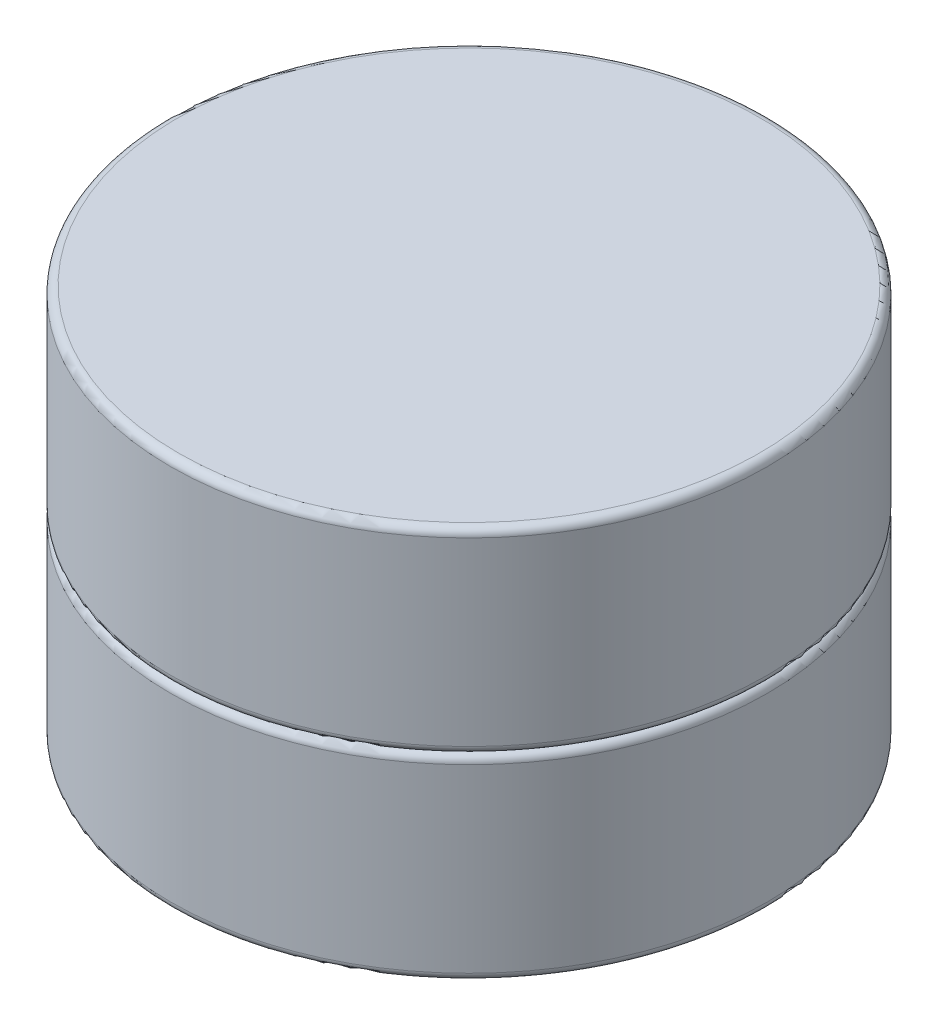
ISO-10303-21;
HEADER;
FILE_DESCRIPTION(('STEP AP214'),'2;1');
FILE_NAME('part.step','',(''),(''),'','','');
FILE_SCHEMA(('AUTOMOTIVE_DESIGN { 1 0 10303 214 1 1 1 1 }'));
ENDSEC;
DATA;
#1=APPLICATION_CONTEXT('core data for automotive mechanical design processes');
#2=APPLICATION_PROTOCOL_DEFINITION('international standard','automotive_design',2000,#1);
#3=PRODUCT_CONTEXT('',#1,'mechanical');
#4=PRODUCT('Part','Part','',(#3));
#5=PRODUCT_RELATED_PRODUCT_CATEGORY('part','',(#4));
#6=PRODUCT_DEFINITION_FORMATION('','',#4);
#7=PRODUCT_DEFINITION_CONTEXT('part definition',#1,'design');
#8=PRODUCT_DEFINITION('design','',#6,#7);
#9=PRODUCT_DEFINITION_SHAPE('','',#8);
#10=(LENGTH_UNIT() NAMED_UNIT(*) SI_UNIT(.MILLI.,.METRE.));
#11=(NAMED_UNIT(*) PLANE_ANGLE_UNIT() SI_UNIT($,.RADIAN.));
#12=(NAMED_UNIT(*) SI_UNIT($,.STERADIAN.) SOLID_ANGLE_UNIT());
#13=UNCERTAINTY_MEASURE_WITH_UNIT(LENGTH_MEASURE(1.E-05),#10,'distance_accuracy_value','');
#14=(GEOMETRIC_REPRESENTATION_CONTEXT(3) GLOBAL_UNCERTAINTY_ASSIGNED_CONTEXT((#13)) GLOBAL_UNIT_ASSIGNED_CONTEXT((#10,
#11,#12)) REPRESENTATION_CONTEXT('',''));
#15=CARTESIAN_POINT('',(0.,0.,0.));
#16=DIRECTION('',(0.,0.,1.));
#17=DIRECTION('',(1.,0.,0.));
#18=AXIS2_PLACEMENT_3D('',#15,#16,#17);
#19=CARTESIAN_POINT('',(-37.01,25.,37.7502));
#20=DIRECTION('',(0.,1.,0.));
#21=DIRECTION('',(1.,0.,0.));
#22=AXIS2_PLACEMENT_3D('',#19,#20,#21);
#23=PLANE('',#22);
#24=CARTESIAN_POINT('',(0.,25.,0.));
#25=DIRECTION('',(0.,1.,0.));
#26=DIRECTION('',(0.,0.,1.));
#27=AXIS2_PLACEMENT_3D('',#24,#25,#26);
#28=CIRCLE('',#27,37.);
#29=CARTESIAN_POINT('',(0.,25.,37.));
#30=VERTEX_POINT('',#29);
#31=EDGE_CURVE('P0_E19',#30,#30,#28,.F.);
#32=ORIENTED_EDGE('',*,*,#31,.F.);
#33=EDGE_LOOP('',(#32));
#34=FACE_BOUND('',#33,.T.);
#35=ADVANCED_FACE('P0_F15',(#34),#23,.T.);
#36=CARTESIAN_POINT('',(0.,24.,0.));
#37=DIRECTION('',(0.,1.,0.));
#38=DIRECTION('',(0.,0.,1.));
#39=AXIS2_PLACEMENT_3D('',#36,#37,#38);
#40=TOROIDAL_SURFACE('',#39,37.,0.999999999999998);
#41=CARTESIAN_POINT('',(0.,24.,0.));
#42=DIRECTION('',(0.,-1.,0.));
#43=DIRECTION('',(0.,0.,-1.));
#44=AXIS2_PLACEMENT_3D('',#41,#42,#43);
#45=CIRCLE('',#44,38.);
#46=CARTESIAN_POINT('',(0.,24.,-38.));
#47=VERTEX_POINT('',#46);
#48=EDGE_CURVE('P0_E27',#47,#47,#45,.T.);
#49=ORIENTED_EDGE('',*,*,#48,.F.);
#50=EDGE_LOOP('',(#49));
#51=FACE_BOUND('',#50,.T.);
#52=ORIENTED_EDGE('',*,*,#31,.T.);
#53=EDGE_LOOP('',(#52));
#54=FACE_BOUND('',#53,.T.);
#55=ADVANCED_FACE('P0_F36',(#51,#54),#40,.T.);
#56=CARTESIAN_POINT('',(0.,24.,0.));
#57=DIRECTION('',(0.,-1.,0.));
#58=DIRECTION('',(0.,0.,-1.));
#59=AXIS2_PLACEMENT_3D('',#56,#57,#58);
#60=CYLINDRICAL_SURFACE('',#59,38.);
#61=CARTESIAN_POINT('',(0.,1.,0.));
#62=DIRECTION('',(0.,-1.,0.));
#63=DIRECTION('',(0.,0.,-1.));
#64=AXIS2_PLACEMENT_3D('',#61,#62,#63);
#65=CIRCLE('',#64,38.);
#66=CARTESIAN_POINT('',(0.,1.,-38.));
#67=VERTEX_POINT('',#66);
#68=EDGE_CURVE('P0_E23',#67,#67,#65,.T.);
#69=ORIENTED_EDGE('',*,*,#68,.F.);
#70=EDGE_LOOP('',(#69));
#71=FACE_BOUND('',#70,.T.);
#72=ORIENTED_EDGE('',*,*,#48,.T.);
#73=EDGE_LOOP('',(#72));
#74=FACE_BOUND('',#73,.T.);
#75=ADVANCED_FACE('P0_F44',(#71,#74),#60,.T.);
#76=CARTESIAN_POINT('',(37.7502,0.,37.7502));
#77=DIRECTION('',(0.,-1.,0.));
#78=DIRECTION('',(-1.,0.,0.));
#79=AXIS2_PLACEMENT_3D('',#76,#77,#78);
#80=PLANE('',#79);
#81=CARTESIAN_POINT('',(0.,0.,0.));
#82=DIRECTION('',(0.,1.,0.));
#83=DIRECTION('',(0.,0.,1.));
#84=AXIS2_PLACEMENT_3D('',#81,#82,#83);
#85=CIRCLE('',#84,37.);
#86=CARTESIAN_POINT('',(0.,0.,37.));
#87=VERTEX_POINT('',#86);
#88=EDGE_CURVE('P0_E10',#87,#87,#85,.T.);
#89=ORIENTED_EDGE('',*,*,#88,.F.);
#90=EDGE_LOOP('',(#89));
#91=FACE_BOUND('',#90,.T.);
#92=ADVANCED_FACE('P0_F48',(#91),#80,.T.);
#93=CARTESIAN_POINT('',(0.,1.,0.));
#94=DIRECTION('',(0.,1.,0.));
#95=DIRECTION('',(0.,0.,1.));
#96=AXIS2_PLACEMENT_3D('',#93,#94,#95);
#97=TOROIDAL_SURFACE('',#96,37.,1.);
#98=ORIENTED_EDGE('',*,*,#88,.T.);
#99=EDGE_LOOP('',(#98));
#100=FACE_BOUND('',#99,.T.);
#101=ORIENTED_EDGE('',*,*,#68,.T.);
#102=EDGE_LOOP('',(#101));
#103=FACE_BOUND('',#102,.T.);
#104=ADVANCED_FACE('P0_F17',(#100,#103),#97,.T.);
#105=CLOSED_SHELL('',(#35,#55,#75,#92,#104));
#106=MANIFOLD_SOLID_BREP('P0_B1',#105);
#107=CARTESIAN_POINT('',(-37.01,50.,37.7502));
#108=DIRECTION('',(0.,1.,0.));
#109=DIRECTION('',(1.,0.,0.));
#110=AXIS2_PLACEMENT_3D('',#107,#108,#109);
#111=PLANE('',#110);
#112=CARTESIAN_POINT('',(0.,50.,0.));
#113=DIRECTION('',(0.,1.,0.));
#114=DIRECTION('',(0.,0.,1.));
#115=AXIS2_PLACEMENT_3D('',#112,#113,#114);
#116=CIRCLE('',#115,37.);
#117=CARTESIAN_POINT('',(0.,50.,37.));
#118=VERTEX_POINT('',#117);
#119=EDGE_CURVE('P1_E18',#118,#118,#116,.F.);
#120=ORIENTED_EDGE('',*,*,#119,.F.);
#121=EDGE_LOOP('',(#120));
#122=FACE_BOUND('',#121,.T.);
#123=ADVANCED_FACE('P1_F14',(#122),#111,.T.);
#124=CARTESIAN_POINT('',(0.,49.,0.));
#125=DIRECTION('',(0.,1.,0.));
#126=DIRECTION('',(0.,0.,1.));
#127=AXIS2_PLACEMENT_3D('',#124,#125,#126);
#128=TOROIDAL_SURFACE('',#127,37.,1.00000000000001);
#129=CARTESIAN_POINT('',(0.,49.,0.));
#130=DIRECTION('',(0.,-1.,0.));
#131=DIRECTION('',(0.,0.,-1.));
#132=AXIS2_PLACEMENT_3D('',#129,#130,#131);
#133=CIRCLE('',#132,38.);
#134=CARTESIAN_POINT('',(0.,49.,-38.));
#135=VERTEX_POINT('',#134);
#136=EDGE_CURVE('P1_E26',#135,#135,#133,.T.);
#137=ORIENTED_EDGE('',*,*,#136,.F.);
#138=EDGE_LOOP('',(#137));
#139=FACE_BOUND('',#138,.T.);
#140=ORIENTED_EDGE('',*,*,#119,.T.);
#141=EDGE_LOOP('',(#140));
#142=FACE_BOUND('',#141,.T.);
#143=ADVANCED_FACE('P1_F35',(#139,#142),#128,.T.);
#144=CARTESIAN_POINT('',(0.,49.,0.));
#145=DIRECTION('',(0.,-1.,0.));
#146=DIRECTION('',(0.,0.,-1.));
#147=AXIS2_PLACEMENT_3D('',#144,#145,#146);
#148=CYLINDRICAL_SURFACE('',#147,38.);
#149=CARTESIAN_POINT('',(0.,26.,0.));
#150=DIRECTION('',(0.,-1.,0.));
#151=DIRECTION('',(0.,0.,-1.));
#152=AXIS2_PLACEMENT_3D('',#149,#150,#151);
#153=CIRCLE('',#152,38.);
#154=CARTESIAN_POINT('',(0.,26.,-38.));
#155=VERTEX_POINT('',#154);
#156=EDGE_CURVE('P1_E22',#155,#155,#153,.T.);
#157=ORIENTED_EDGE('',*,*,#156,.F.);
#158=EDGE_LOOP('',(#157));
#159=FACE_BOUND('',#158,.T.);
#160=ORIENTED_EDGE('',*,*,#136,.T.);
#161=EDGE_LOOP('',(#160));
#162=FACE_BOUND('',#161,.T.);
#163=ADVANCED_FACE('P1_F43',(#159,#162),#148,.T.);
#164=CARTESIAN_POINT('',(37.7502,25.,37.7502));
#165=DIRECTION('',(0.,-1.,0.));
#166=DIRECTION('',(-1.,0.,0.));
#167=AXIS2_PLACEMENT_3D('',#164,#165,#166);
#168=PLANE('',#167);
#169=CARTESIAN_POINT('',(0.,25.,0.));
#170=DIRECTION('',(0.,1.,0.));
#171=DIRECTION('',(0.,0.,1.));
#172=AXIS2_PLACEMENT_3D('',#169,#170,#171);
#173=CIRCLE('',#172,37.);
#174=CARTESIAN_POINT('',(0.,25.,37.));
#175=VERTEX_POINT('',#174);
#176=EDGE_CURVE('P1_E9',#175,#175,#173,.T.);
#177=ORIENTED_EDGE('',*,*,#176,.F.);
#178=EDGE_LOOP('',(#177));
#179=FACE_BOUND('',#178,.T.);
#180=ADVANCED_FACE('P1_F47',(#179),#168,.T.);
#181=CARTESIAN_POINT('',(0.,26.,0.));
#182=DIRECTION('',(0.,1.,0.));
#183=DIRECTION('',(0.,0.,1.));
#184=AXIS2_PLACEMENT_3D('',#181,#182,#183);
#185=TOROIDAL_SURFACE('',#184,37.,1.);
#186=ORIENTED_EDGE('',*,*,#176,.T.);
#187=EDGE_LOOP('',(#186));
#188=FACE_BOUND('',#187,.T.);
#189=ORIENTED_EDGE('',*,*,#156,.T.);
#190=EDGE_LOOP('',(#189));
#191=FACE_BOUND('',#190,.T.);
#192=ADVANCED_FACE('P1_F16',(#188,#191),#185,.T.);
#193=CLOSED_SHELL('',(#123,#143,#163,#180,#192));
#194=MANIFOLD_SOLID_BREP('P1_B1',#193);
#195=ADVANCED_BREP_SHAPE_REPRESENTATION('',(#18,#106,#194),#14);
#196=SHAPE_DEFINITION_REPRESENTATION(#9,#195);
ENDSEC;
END-ISO-10303-21;
